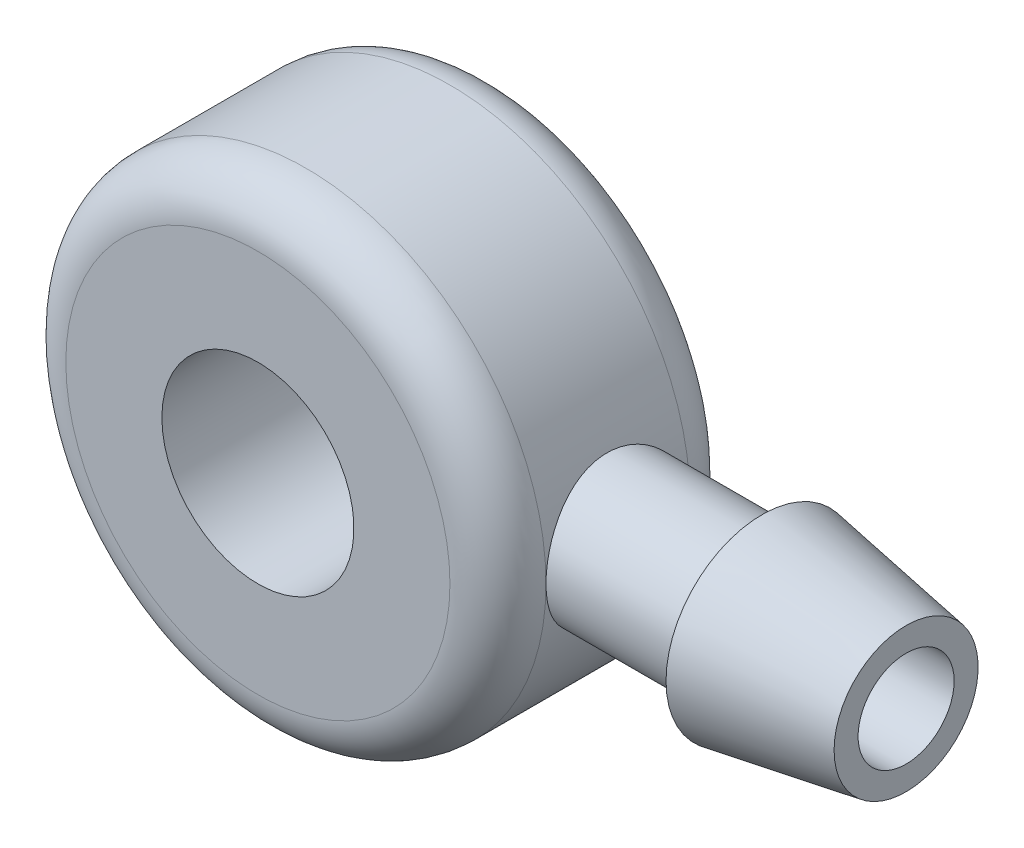
ISO-10303-21;
HEADER;
FILE_DESCRIPTION(('STEP AP214'),'2;1');
FILE_NAME('part.step','',(''),(''),'','','');
FILE_SCHEMA(('AUTOMOTIVE_DESIGN { 1 0 10303 214 1 1 1 1 }'));
ENDSEC;
DATA;
#1=APPLICATION_CONTEXT('core data for automotive mechanical design processes');
#2=APPLICATION_PROTOCOL_DEFINITION('international standard','automotive_design',2000,#1);
#3=PRODUCT_CONTEXT('',#1,'mechanical');
#4=PRODUCT('Part','Part','',(#3));
#5=PRODUCT_RELATED_PRODUCT_CATEGORY('part','',(#4));
#6=PRODUCT_DEFINITION_FORMATION('','',#4);
#7=PRODUCT_DEFINITION_CONTEXT('part definition',#1,'design');
#8=PRODUCT_DEFINITION('design','',#6,#7);
#9=PRODUCT_DEFINITION_SHAPE('','',#8);
#10=(LENGTH_UNIT() NAMED_UNIT(*) SI_UNIT(.MILLI.,.METRE.));
#11=(NAMED_UNIT(*) PLANE_ANGLE_UNIT() SI_UNIT($,.RADIAN.));
#12=(NAMED_UNIT(*) SI_UNIT($,.STERADIAN.) SOLID_ANGLE_UNIT());
#13=UNCERTAINTY_MEASURE_WITH_UNIT(LENGTH_MEASURE(1.E-05),#10,'distance_accuracy_value','');
#14=(GEOMETRIC_REPRESENTATION_CONTEXT(3) GLOBAL_UNCERTAINTY_ASSIGNED_CONTEXT((#13)) GLOBAL_UNIT_ASSIGNED_CONTEXT((#10,
#11,#12)) REPRESENTATION_CONTEXT('',''));
#15=CARTESIAN_POINT('',(0.,0.,0.));
#16=DIRECTION('',(0.,0.,1.));
#17=DIRECTION('',(1.,0.,0.));
#18=AXIS2_PLACEMENT_3D('',#15,#16,#17);
#19=CARTESIAN_POINT('',(0.,0.,5.));
#20=DIRECTION('',(0.,0.,-0.999999999999998));
#21=DIRECTION('',(-0.999999999999999,0.,0.));
#22=AXIS2_PLACEMENT_3D('',#19,#20,#21);
#23=CYLINDRICAL_SURFACE('',#22,5.);
#24=CARTESIAN_POINT('',(5.,0.,4.));
#25=CARTESIAN_POINT('',(4.99999929250549,-0.0822886127532972,3.99999900251511));
#26=CARTESIAN_POINT('',(4.99794915693951,-0.164587318351523,3.99320613637603));
#27=CARTESIAN_POINT('',(4.98997105593694,-0.326788125304873,3.9662786457779));
#28=CARTESIAN_POINT('',(4.98404193389702,-0.406689504411414,3.94614004197665));
#29=CARTESIAN_POINT('',(4.96895552501846,-0.561732707754519,3.89325398308974));
#30=CARTESIAN_POINT('',(4.95980300250428,-0.636881364395363,3.86052513038107));
#31=CARTESIAN_POINT('',(4.93922109237643,-0.780624181053123,3.78346390694417));
#32=CARTESIAN_POINT('',(4.92779140192067,-0.849217467469665,3.73912999260458));
#33=CARTESIAN_POINT('',(4.90350737192777,-0.979871797183748,3.63877599252733));
#34=CARTESIAN_POINT('',(4.89062383657039,-1.04171807124435,3.58248337411409));
#35=CARTESIAN_POINT('',(4.8650583421044,-1.15524920923323,3.46039077008982));
#36=CARTESIAN_POINT('',(4.85237641724493,-1.20693236327439,3.39458918787504));
#37=CARTESIAN_POINT('',(4.82834113993764,-1.29980037723706,3.25352924696239));
#38=CARTESIAN_POINT('',(4.81702406663872,-1.34072309022213,3.17809153900926));
#39=CARTESIAN_POINT('',(4.79743620394033,-1.40921394774761,3.0210107457697));
#40=CARTESIAN_POINT('',(4.78916468313312,-1.43678529919973,2.93936915607202));
#41=CARTESIAN_POINT('',(4.77690870838434,-1.47701633682651,2.77460973386954));
#42=CARTESIAN_POINT('',(4.77281069324533,-1.49007196234677,2.69159725613605));
#43=CARTESIAN_POINT('',(4.76902789749767,-1.50213730614672,2.52446684378323));
#44=CARTESIAN_POINT('',(4.76934204760572,-1.50115042761078,2.44034918194091));
#45=CARTESIAN_POINT('',(4.77424744067778,-1.48546977199812,2.27661609139152));
#46=CARTESIAN_POINT('',(4.7786838859914,-1.47127205262685,2.19694774963776));
#47=CARTESIAN_POINT('',(4.79108356228624,-1.43037420427056,2.04118021372654));
#48=CARTESIAN_POINT('',(4.79904714132352,-1.40367284141641,1.96508137262567));
#49=CARTESIAN_POINT('',(4.81772733074974,-1.33816026653681,1.81739965033926));
#50=CARTESIAN_POINT('',(4.82848016115953,-1.29918816934642,1.74589291604474));
#51=CARTESIAN_POINT('',(4.85150987000064,-1.21035222588683,1.6102679779898));
#52=CARTESIAN_POINT('',(4.8637871174699,-1.16048574002588,1.54615157058622));
#53=CARTESIAN_POINT('',(4.88911011297936,-1.04881290765546,1.42431380923798));
#54=CARTESIAN_POINT('',(4.90216654310498,-0.986594907466974,1.36697133597033));
#55=CARTESIAN_POINT('',(4.92712244063259,-0.853263259313969,1.26344601593575));
#56=CARTESIAN_POINT('',(4.9390218351841,-0.782149051860888,1.21726387158558));
#57=CARTESIAN_POINT('',(4.9604316006947,-0.6323550383428,1.13714007753527));
#58=CARTESIAN_POINT('',(4.96992543668314,-0.553627749747945,1.10328248375014));
#59=CARTESIAN_POINT('',(4.98533521832222,-0.391245415603507,1.04940040990036));
#60=CARTESIAN_POINT('',(4.99125216187,-0.307591751589565,1.0293720714675));
#61=CARTESIAN_POINT('',(4.99868364643539,-0.140952242668315,1.0043478221006));
#62=CARTESIAN_POINT('',(5.00034850417791,-0.0580500976011743,0.998838414198388));
#63=CARTESIAN_POINT('',(4.99952923241759,0.107499605823388,1.00156915571208));
#64=CARTESIAN_POINT('',(4.99704565677755,0.190147196690782,1.00980746965144));
#65=CARTESIAN_POINT('',(4.98830696987162,0.350903605309694,1.03938461111149));
#66=CARTESIAN_POINT('',(4.98213829799416,0.429072772614167,1.06042338758087));
#67=CARTESIAN_POINT('',(4.96674347841534,0.58075463895452,1.1146432327782));
#68=CARTESIAN_POINT('',(4.95751696321086,0.654266777025581,1.14782576103786));
#69=CARTESIAN_POINT('',(4.93669654351325,0.796437189461047,1.22625316548113));
#70=CARTESIAN_POINT('',(4.92505280829674,0.864943826199663,1.27175934094796));
#71=CARTESIAN_POINT('',(4.9007346876432,0.993523307980136,1.37322475405281));
#72=CARTESIAN_POINT('',(4.88806004431087,1.05359403235592,1.42918661188768));
#73=CARTESIAN_POINT('',(4.86253171869145,1.16585744551026,1.55238730836935));
#74=CARTESIAN_POINT('',(4.8496882503327,1.21768481231503,1.61996187577173));
#75=CARTESIAN_POINT('',(4.82576515238462,1.30928995072154,1.76312793901352));
#76=CARTESIAN_POINT('',(4.81468547654652,1.34906803829472,1.83871922455821));
#77=CARTESIAN_POINT('',(4.79567189615057,1.41517347127169,1.99553249125469));
#78=CARTESIAN_POINT('',(4.78772337843828,1.4415634693705,2.07672618653659));
#79=CARTESIAN_POINT('',(4.77591594362795,1.48021730815114,2.24268796893148));
#80=CARTESIAN_POINT('',(4.77205562508301,1.49248598978779,2.32745482078767));
#81=CARTESIAN_POINT('',(4.76899972496087,1.50221984485059,2.49436151837623));
#82=CARTESIAN_POINT('',(4.76961647442754,1.5002805530849,2.57646365101759));
#83=CARTESIAN_POINT('',(4.77499401288296,1.48307505444813,2.7391141033728));
#84=CARTESIAN_POINT('',(4.77975463592555,1.46780938124716,2.81966248517635));
#85=CARTESIAN_POINT('',(4.79275763670389,1.42476888804136,2.97594539914285));
#86=CARTESIAN_POINT('',(4.80095604545965,1.39715175507068,3.0517272873617));
#87=CARTESIAN_POINT('',(4.81990278909137,1.33031507121129,3.19764243881773));
#88=CARTESIAN_POINT('',(4.83065161194315,1.29109329962877,3.26777461764076));
#89=CARTESIAN_POINT('',(4.85397676425836,1.20048763805073,3.40316311652711));
#90=CARTESIAN_POINT('',(4.86660540163799,1.14871276092994,3.46814876126041));
#91=CARTESIAN_POINT('',(4.89201320450026,1.03517434629782,3.58870249830786));
#92=CARTESIAN_POINT('',(4.90479240823905,0.973408217134498,3.64426813946776));
#93=CARTESIAN_POINT('',(4.92950936570649,0.839465762183246,3.74602341229503));
#94=CARTESIAN_POINT('',(4.94141159765674,0.767037885790605,3.79189144685549));
#95=CARTESIAN_POINT('',(4.96260680455814,0.615141373983528,3.87073516990402));
#96=CARTESIAN_POINT('',(4.97190099931068,0.535676052998955,3.90371688827451));
#97=CARTESIAN_POINT('',(4.98602174969302,0.380757712655283,3.95289527565275));
#98=CARTESIAN_POINT('',(4.99122027381068,0.305786961954235,3.97051167288325));
#99=CARTESIAN_POINT('',(4.99820944494493,0.15388019523078,3.99406352524158));
#100=CARTESIAN_POINT('',(5.00000066154741,0.0769445098581394,4.00000093270482));
#101=CARTESIAN_POINT('',(5.,0.,4.));
#102=B_SPLINE_CURVE_WITH_KNOTS('',3,(#24,#25,#26,#27,#28,#29,#30,#31,#32,#33,#34,#35,#36,#37,
#38,#39,#40,#41,#42,#43,#44,#45,#46,#47,#48,#49,#50,#51,#52,#53,#54,#55,#56,#57,#58,#59,#60,#61,
#62,#63,#64,#65,#66,#67,#68,#69,#70,#71,#72,#73,#74,#75,#76,#77,#78,#79,#80,#81,#82,#83,#84,#85,
#86,#87,#88,#89,#90,#91,#92,#93,#94,#95,#96,#97,#98,#99,#100,#101),.UNSPECIFIED.,.T.,.F.,(4,2,2,
2,2,2,2,2,2,2,2,2,2,2,2,2,2,2,2,2,2,2,2,2,2,2,2,2,2,2,2,2,2,2,2,2,2,2,4),(0.,0.246583203612604,
0.493239964845984,0.739533676300867,0.985860164412703,1.23855602948192,1.49129437288633,
1.74971481004109,2.00807314543224,2.25919689356599,2.51025978319089,2.75226016697676,
2.99428443658002,3.2396242644712,3.48502360158555,3.74067104048166,3.99633456531071,
4.2537104688169,4.5110145352881,4.75908809438546,5.00712853550326,5.24956746682327,
5.49203554593728,5.74011305702907,5.98825282000189,6.24540400322818,6.5025484425268,
6.75847814951251,7.01432009460283,7.25950155466943,7.504673196616,7.74680040402721,
7.98897397553107,8.2399692567993,8.49102974897502,8.7494299615667,9.00770911595235,
9.23831691930459,9.46888616948874),.UNSPECIFIED.);
#103=CARTESIAN_POINT('',(5.,0.,4.));
#104=VERTEX_POINT('',#103);
#105=CARTESIAN_POINT('',(5.,0.,0.999999999999997));
#106=VERTEX_POINT('',#105);
#107=EDGE_CURVE('E74',#104,#106,#102,.T.);
#108=ORIENTED_EDGE('',*,*,#107,.F.);
#109=CARTESIAN_POINT('',(0.,0.,4.00000000000001));
#110=DIRECTION('',(0.,0.,0.999999999999998));
#111=DIRECTION('',(0.999999999999999,0.,0.));
#112=AXIS2_PLACEMENT_3D('',#109,#110,#111);
#113=CIRCLE('',#112,5.);
#114=EDGE_CURVE('E52',#104,#104,#113,.F.);
#115=ORIENTED_EDGE('',*,*,#114,.T.);
#116=EDGE_CURVE('E49',#106,#104,#102,.T.);
#117=ORIENTED_EDGE('',*,*,#116,.F.);
#118=CARTESIAN_POINT('',(0.,0.,0.999999999999997));
#119=DIRECTION('',(0.,0.,0.999999999999998));
#120=DIRECTION('',(0.999999999999999,0.,0.));
#121=AXIS2_PLACEMENT_3D('',#118,#119,#120);
#122=CIRCLE('',#121,5.);
#123=EDGE_CURVE('E55',#106,#106,#122,.T.);
#124=ORIENTED_EDGE('',*,*,#123,.T.);
#125=EDGE_LOOP('',(#108,#115,#117,#124));
#126=FACE_BOUND('',#125,.T.);
#127=ADVANCED_FACE('F34',(#126),#23,.T.);
#128=CARTESIAN_POINT('',(0.,0.,5.));
#129=DIRECTION('',(0.,0.,0.999999999999998));
#130=DIRECTION('',(0.999999999999999,0.,0.));
#131=AXIS2_PLACEMENT_3D('',#128,#129,#130);
#132=PLANE('',#131);
#133=CARTESIAN_POINT('',(0.,0.,5.));
#134=DIRECTION('',(0.,0.,-0.999999999999998));
#135=DIRECTION('',(-0.999999999999999,0.,0.));
#136=AXIS2_PLACEMENT_3D('',#133,#134,#135);
#137=CIRCLE('',#136,2.);
#138=CARTESIAN_POINT('',(-2.,0.,5.));
#139=VERTEX_POINT('',#138);
#140=EDGE_CURVE('E56',#139,#139,#137,.T.);
#141=ORIENTED_EDGE('',*,*,#140,.T.);
#142=EDGE_LOOP('',(#141));
#143=FACE_BOUND('',#142,.T.);
#144=CARTESIAN_POINT('',(0.,0.,5.));
#145=DIRECTION('',(0.,0.,0.999999999999998));
#146=DIRECTION('',(0.999999999999999,0.,0.));
#147=AXIS2_PLACEMENT_3D('',#144,#145,#146);
#148=CIRCLE('',#147,4.);
#149=CARTESIAN_POINT('',(4.,0.,5.));
#150=VERTEX_POINT('',#149);
#151=EDGE_CURVE('E11',#150,#150,#148,.T.);
#152=ORIENTED_EDGE('',*,*,#151,.T.);
#153=EDGE_LOOP('',(#152));
#154=FACE_BOUND('',#153,.T.);
#155=ADVANCED_FACE('F100',(#143,#154),#132,.T.);
#156=CARTESIAN_POINT('',(0.,0.,0.));
#157=DIRECTION('',(0.,0.,0.999999999999998));
#158=DIRECTION('',(0.999999999999999,0.,0.));
#159=AXIS2_PLACEMENT_3D('',#156,#157,#158);
#160=PLANE('',#159);
#161=CARTESIAN_POINT('',(0.,0.,0.));
#162=DIRECTION('',(0.,0.,-0.999999999999998));
#163=DIRECTION('',(-0.999999999999999,0.,0.));
#164=AXIS2_PLACEMENT_3D('',#161,#162,#163);
#165=CIRCLE('',#164,2.);
#166=CARTESIAN_POINT('',(-2.,0.,0.));
#167=VERTEX_POINT('',#166);
#168=EDGE_CURVE('E60',#167,#167,#165,.T.);
#169=ORIENTED_EDGE('',*,*,#168,.F.);
#170=EDGE_LOOP('',(#169));
#171=FACE_BOUND('',#170,.T.);
#172=CARTESIAN_POINT('',(0.,0.,0.));
#173=DIRECTION('',(0.,0.,0.999999999999998));
#174=DIRECTION('',(0.999999999999999,0.,0.));
#175=AXIS2_PLACEMENT_3D('',#172,#173,#174);
#176=CIRCLE('',#175,4.);
#177=CARTESIAN_POINT('',(4.,0.,0.));
#178=VERTEX_POINT('',#177);
#179=EDGE_CURVE('E42',#178,#178,#176,.F.);
#180=ORIENTED_EDGE('',*,*,#179,.T.);
#181=EDGE_LOOP('',(#180));
#182=FACE_BOUND('',#181,.T.);
#183=ADVANCED_FACE('F66',(#171,#182),#160,.F.);
#184=CARTESIAN_POINT('',(0.,0.,0.999999999999997));
#185=DIRECTION('',(0.,0.,0.999999999999998));
#186=DIRECTION('',(0.999999999999999,0.,0.));
#187=AXIS2_PLACEMENT_3D('',#184,#185,#186);
#188=TOROIDAL_SURFACE('',#187,4.,1.);
#189=ORIENTED_EDGE('',*,*,#179,.F.);
#190=EDGE_LOOP('',(#189));
#191=FACE_BOUND('',#190,.T.);
#192=ORIENTED_EDGE('',*,*,#123,.F.);
#193=EDGE_LOOP('',(#192));
#194=FACE_BOUND('',#193,.T.);
#195=ADVANCED_FACE('F68',(#191,#194),#188,.T.);
#196=CARTESIAN_POINT('',(0.,0.,4.00000000000001));
#197=DIRECTION('',(0.,0.,0.999999999999998));
#198=DIRECTION('',(0.999999999999999,0.,0.));
#199=AXIS2_PLACEMENT_3D('',#196,#197,#198);
#200=TOROIDAL_SURFACE('',#199,4.,1.);
#201=ORIENTED_EDGE('',*,*,#114,.F.);
#202=EDGE_LOOP('',(#201));
#203=FACE_BOUND('',#202,.T.);
#204=ORIENTED_EDGE('',*,*,#151,.F.);
#205=EDGE_LOOP('',(#204));
#206=FACE_BOUND('',#205,.T.);
#207=ADVANCED_FACE('F36',(#203,#206),#200,.T.);
#208=CARTESIAN_POINT('',(0.,0.,5.));
#209=DIRECTION('',(0.,0.,-0.999999999999998));
#210=DIRECTION('',(-0.999999999999999,0.,0.));
#211=AXIS2_PLACEMENT_3D('',#208,#209,#210);
#212=CYLINDRICAL_SURFACE('',#211,2.);
#213=CARTESIAN_POINT('',(2.,0.,1.5));
#214=CARTESIAN_POINT('',(1.99999713404151,0.0525719629529868,1.5000033023195));
#215=CARTESIAN_POINT('',(1.99790491019518,0.105206599698033,1.50417007312167));
#216=CARTESIAN_POINT('',(1.98974156037396,0.208920235268427,1.52065288034092));
#217=CARTESIAN_POINT('',(1.98366287828983,0.259996086713506,1.53298439299765));
#218=CARTESIAN_POINT('',(1.96816279403311,0.358933544880577,1.56519380861679));
#219=CARTESIAN_POINT('',(1.9587543917752,0.406806802939181,1.58504238424801));
#220=CARTESIAN_POINT('',(1.93745776515779,0.498472616806566,1.63157062136494));
#221=CARTESIAN_POINT('',(1.92556973633531,0.542265493990052,1.65824974424885));
#222=CARTESIAN_POINT('',(1.89956258258058,0.627507817761921,1.7195172494853));
#223=CARTESIAN_POINT('',(1.88535199127536,0.668655211122112,1.75448647923964));
#224=CARTESIAN_POINT('',(1.85659970246744,0.744779444866977,1.83052147924703));
#225=CARTESIAN_POINT('',(1.84205776209035,0.779751583106768,1.87159185177244));
#226=CARTESIAN_POINT('',(1.81298951197347,0.84525200045028,1.96248334952338));
#227=CARTESIAN_POINT('',(1.79855186970132,0.875225335551637,2.01273609834591));
#228=CARTESIAN_POINT('',(1.77285978772321,0.926168226890691,2.11836733598621));
#229=CARTESIAN_POINT('',(1.7616030760699,0.947144214966327,2.17374212872274));
#230=CARTESIAN_POINT('',(1.74457867037809,0.978132442188584,2.28466510542192));
#231=CARTESIAN_POINT('',(1.73852271583714,0.98872585708044,2.34000445206739));
#232=CARTESIAN_POINT('',(1.73181889948528,1.00042699330885,2.45197883777948));
#233=CARTESIAN_POINT('',(1.73116569343288,1.00154408837307,2.50861254087116));
#234=CARTESIAN_POINT('',(1.73510930257248,0.994687287172294,2.61428602431537));
#235=CARTESIAN_POINT('',(1.73908763662014,0.987784559536822,2.66342403122305));
#236=CARTESIAN_POINT('',(1.75076228733851,0.966939849056932,2.75972190937304));
#237=CARTESIAN_POINT('',(1.75845978831777,0.95299562389765,2.80688114530532));
#238=CARTESIAN_POINT('',(1.77687476412742,0.918209780386002,2.89922913256566));
#239=CARTESIAN_POINT('',(1.78765840663999,0.897215067115995,2.94434639878579));
#240=CARTESIAN_POINT('',(1.81103404281404,0.849041687668003,3.03063429259001));
#241=CARTESIAN_POINT('',(1.8236268478019,0.821860243812466,3.07180313560009));
#242=CARTESIAN_POINT('',(1.85113157903285,0.758066054912783,3.15452125274323));
#243=CARTESIAN_POINT('',(1.86613510236744,0.720694458369273,3.19545687357616));
#244=CARTESIAN_POINT('',(1.8954762330041,0.639555578741371,3.27073541859091));
#245=CARTESIAN_POINT('',(1.90981351958809,0.595785256574292,3.30507519203388));
#246=CARTESIAN_POINT('',(1.93701987282972,0.500516505831853,3.36768566102972));
#247=CARTESIAN_POINT('',(1.9497898416201,0.448753591599403,3.39560047244574));
#248=CARTESIAN_POINT('',(1.9715788112124,0.340466215488785,3.44209702904301));
#249=CARTESIAN_POINT('',(1.98060078943552,0.283945576265268,3.46068618501517));
#250=CARTESIAN_POINT('',(1.99324333741437,0.172766491660697,3.48647540371668));
#251=CARTESIAN_POINT('',(1.99724938301312,0.11834153054832,3.49449123574678));
#252=CARTESIAN_POINT('',(2.00073013459102,0.00877959994935154,3.50146473113449));
#253=CARTESIAN_POINT('',(2.00020698721312,-0.046357019869901,3.50042668563948));
#254=CARTESIAN_POINT('',(1.99491192253441,-0.151232971985993,3.48979331158124));
#255=CARTESIAN_POINT('',(1.99047245688189,-0.201059408049955,3.48086746726997));
#256=CARTESIAN_POINT('',(1.97822171314819,-0.298406892301922,3.45576192810491));
#257=CARTESIAN_POINT('',(1.97041006334333,-0.345927685691004,3.43958143354664));
#258=CARTESIAN_POINT('',(1.9518425141367,-0.438888608449672,3.40000153356682));
#259=CARTESIAN_POINT('',(1.94100881769939,-0.484230397006158,3.37640894988319));
#260=CARTESIAN_POINT('',(1.91743974317109,-0.570461361698922,3.32289246435396));
#261=CARTESIAN_POINT('',(1.90470355565786,-0.611348629775283,3.29296586540656));
#262=CARTESIAN_POINT('',(1.87708221337465,-0.69176768929065,3.22423957466713));
#263=CARTESIAN_POINT('',(1.8621088484844,-0.730772077824632,3.18485713154644));
#264=CARTESIAN_POINT('',(1.83262391603875,-0.801856321113236,3.1000748487307));
#265=CARTESIAN_POINT('',(1.81811267381531,-0.833931385690845,3.05467088118363));
#266=CARTESIAN_POINT('',(1.79051192226074,-0.891707914497702,2.95635634579969));
#267=CARTESIAN_POINT('',(1.77752529663474,-0.917025495878637,2.9031887337914));
#268=CARTESIAN_POINT('',(1.75574072368123,-0.958082826013802,2.79248993230748));
#269=CARTESIAN_POINT('',(1.74693738240614,-0.973834915887577,2.73496447349881));
#270=CARTESIAN_POINT('',(1.73561501008664,-0.993861687449686,2.62308977713855));
#271=CARTESIAN_POINT('',(1.7325738346049,-0.999092996400867,2.56896574657096));
#272=CARTESIAN_POINT('',(1.73165354646175,-1.00068915438079,2.46055293282927));
#273=CARTESIAN_POINT('',(1.73377219627552,-0.997057846624398,2.40626423126056));
#274=CARTESIAN_POINT('',(1.74237862050025,-0.981926125592264,2.30451649846798));
#275=CARTESIAN_POINT('',(1.74843094482395,-0.971208314342802,2.2568995298556));
#276=CARTESIAN_POINT('',(1.76371016187915,-0.943175358224646,2.1641918805753));
#277=CARTESIAN_POINT('',(1.77293807569669,-0.925858091159808,2.11910201790803));
#278=CARTESIAN_POINT('',(1.7942853036452,-0.883815745300679,2.02937514901339));
#279=CARTESIAN_POINT('',(1.80655722396186,-0.858671137816454,1.9849720981703));
#280=CARTESIAN_POINT('',(1.83235331634594,-0.802150971636637,1.90072546381941));
#281=CARTESIAN_POINT('',(1.8458781379453,-0.770772171238659,1.86088426948151));
#282=CARTESIAN_POINT('',(1.87462323159321,-0.698203326664648,1.78185801764238));
#283=CARTESIAN_POINT('',(1.8898498331147,-0.656284423010166,1.74334089763807));
#284=CARTESIAN_POINT('',(1.91877752255085,-0.566154806220271,1.67373701657636));
#285=CARTESIAN_POINT('',(1.9324777860804,-0.517940723256784,1.64265426057371));
#286=CARTESIAN_POINT('',(1.95698009585104,-0.415931596819951,1.5887636372378));
#287=CARTESIAN_POINT('',(1.96776096562909,-0.362099503934615,1.56601583058857));
#288=CARTESIAN_POINT('',(1.98501341363465,-0.250742101294191,1.53019183208105));
#289=CARTESIAN_POINT('',(1.99149723372933,-0.193227799623167,1.51708815317042));
#290=CARTESIAN_POINT('',(1.99695461909663,-0.112601946483385,1.50610258892415));
#291=CARTESIAN_POINT('',(1.99809365339201,-0.0901618794394996,1.50381735913638));
#292=CARTESIAN_POINT('',(1.99961696977865,-0.0451517318071581,1.50076533448319));
#293=CARTESIAN_POINT('',(2.00000123103763,-0.0225816476473817,1.4999985815288));
#294=CARTESIAN_POINT('',(2.,0.,1.5));
#295=B_SPLINE_CURVE_WITH_KNOTS('',3,(#213,#214,#215,#216,#217,#218,#219,#220,#221,#222,#223,
#224,#225,#226,#227,#228,#229,#230,#231,#232,#233,#234,#235,#236,#237,#238,#239,#240,#241,#242,
#243,#244,#245,#246,#247,#248,#249,#250,#251,#252,#253,#254,#255,#256,#257,#258,#259,#260,#261,
#262,#263,#264,#265,#266,#267,#268,#269,#270,#271,#272,#273,#274,#275,#276,#277,#278,#279,#280,
#281,#282,#283,#284,#285,#286,#287,#288,#289,#290,#291,#292,#293,#294),.UNSPECIFIED.,.T.,.F.,(4,
2,2,2,2,2,2,2,2,2,2,2,2,2,2,2,2,2,2,2,2,2,2,2,2,2,2,2,2,2,2,2,2,2,2,2,2,2,2,2,4),(0.,
0.157624257420294,0.315548149709201,0.4728621554923,0.630163760581567,0.796981758718089,
0.963926237654036,1.14381726430752,1.3235794789828,1.49258012140229,1.66141357329021,
1.81005712409321,1.95874803925679,2.11090240168487,2.26312521260221,2.43464941333879,
2.60625534598688,2.78583022214442,2.96526216912281,3.12983290471346,3.29432564511476,
3.44606906506122,3.59782921630933,3.75392856027899,3.91009450748339,4.08159610644418,
4.25321588615431,4.43314682159674,4.61284511940779,4.77529307498374,4.93767059860006,
5.08457930244183,5.23153528783677,5.38836456775615,5.54527561138961,5.721252427525,
5.89732383376573,6.07464013662926,6.25144908624931,6.31915280137698,6.38685838514848),.UNSPECIFIED.);
#296=CARTESIAN_POINT('',(2.,0.,1.5));
#297=VERTEX_POINT('',#296);
#298=EDGE_CURVE('E102',#297,#297,#295,.T.);
#299=ORIENTED_EDGE('',*,*,#298,.T.);
#300=EDGE_LOOP('',(#299));
#301=FACE_BOUND('',#300,.T.);
#302=ORIENTED_EDGE('',*,*,#140,.F.);
#303=EDGE_LOOP('',(#302));
#304=FACE_BOUND('',#303,.T.);
#305=ORIENTED_EDGE('',*,*,#168,.T.);
#306=EDGE_LOOP('',(#305));
#307=FACE_BOUND('',#306,.T.);
#308=ADVANCED_FACE('F93',(#301,#304,#307),#212,.F.);
#309=CARTESIAN_POINT('',(5.,0.,2.5));
#310=DIRECTION('',(-0.999999999999999,0.,0.));
#311=DIRECTION('',(0.,0.,0.999999999999998));
#312=AXIS2_PLACEMENT_3D('',#309,#310,#311);
#313=CYLINDRICAL_SURFACE('',#312,1.5);
#314=CARTESIAN_POINT('',(7.99999999999999,0.,2.49999999999999));
#315=DIRECTION('',(-0.999999999999999,0.,0.));
#316=DIRECTION('',(0.,0.,0.999999999999998));
#317=AXIS2_PLACEMENT_3D('',#314,#315,#316);
#318=CIRCLE('',#317,1.5);
#319=CARTESIAN_POINT('',(7.99999999999999,0.,3.99999999999999));
#320=VERTEX_POINT('',#319);
#321=EDGE_CURVE('E78',#320,#320,#318,.T.);
#322=ORIENTED_EDGE('',*,*,#321,.T.);
#323=EDGE_LOOP('',(#322));
#324=FACE_BOUND('',#323,.T.);
#325=ORIENTED_EDGE('',*,*,#116,.T.);
#326=ORIENTED_EDGE('',*,*,#107,.T.);
#327=EDGE_LOOP('',(#325,#326));
#328=FACE_BOUND('',#327,.T.);
#329=ADVANCED_FACE('F75',(#324,#328),#313,.T.);
#330=CARTESIAN_POINT('',(8.00000000000001,0.,1.));
#331=DIRECTION('',(0.999999999999999,0.,0.));
#332=DIRECTION('',(0.,0.,-0.999999999999998));
#333=AXIS2_PLACEMENT_3D('',#330,#331,#332);
#334=PLANE('',#333);
#335=ORIENTED_EDGE('',*,*,#321,.F.);
#336=EDGE_LOOP('',(#335));
#337=FACE_BOUND('',#336,.T.);
#338=CARTESIAN_POINT('',(7.99999999999999,0.,2.49999999999999));
#339=DIRECTION('',(-0.999999999999999,0.,0.));
#340=DIRECTION('',(0.,0.,0.999999999999998));
#341=AXIS2_PLACEMENT_3D('',#338,#339,#340);
#342=CIRCLE('',#341,2.);
#343=CARTESIAN_POINT('',(7.99999999999999,0.,4.49999999999999));
#344=VERTEX_POINT('',#343);
#345=EDGE_CURVE('E206',#344,#344,#342,.T.);
#346=ORIENTED_EDGE('',*,*,#345,.T.);
#347=EDGE_LOOP('',(#346));
#348=FACE_BOUND('',#347,.T.);
#349=ADVANCED_FACE('F92',(#337,#348),#334,.F.);
#350=CARTESIAN_POINT('',(11.,0.,2.5));
#351=DIRECTION('',(-0.999999999999999,0.,0.));
#352=DIRECTION('',(0.,0.,0.999999999999998));
#353=AXIS2_PLACEMENT_3D('',#350,#351,#352);
#354=CONICAL_SURFACE('',#353,1.5,0.165148677414627);
#355=CARTESIAN_POINT('',(11.,0.,2.5));
#356=DIRECTION('',(-0.999999999999999,0.,0.));
#357=DIRECTION('',(0.,0.,0.999999999999998));
#358=AXIS2_PLACEMENT_3D('',#355,#356,#357);
#359=CIRCLE('',#358,1.5);
#360=CARTESIAN_POINT('',(11.,0.,4.));
#361=VERTEX_POINT('',#360);
#362=EDGE_CURVE('E110',#361,#361,#359,.T.);
#363=CARTESIAN_POINT('',(7.99999999999999,0.,4.49999999999999));
#364=CARTESIAN_POINT('',(8.03124999999999,0.,4.49479166666666));
#365=CARTESIAN_POINT('',(8.06249999999999,0.,4.48958333333333));
#366=CARTESIAN_POINT('',(8.12499999999999,0.,4.47916666666666));
#367=CARTESIAN_POINT('',(8.15624999999999,0.,4.47395833333333));
#368=CARTESIAN_POINT('',(8.21874999999999,0.,4.46354166666666));
#369=CARTESIAN_POINT('',(8.24999999999999,0.,4.45833333333333));
#370=CARTESIAN_POINT('',(8.31249999999999,0.,4.44791666666666));
#371=CARTESIAN_POINT('',(8.34374999999999,0.,4.44270833333333));
#372=CARTESIAN_POINT('',(8.40624999999999,0.,4.43229166666666));
#373=CARTESIAN_POINT('',(8.43749999999999,0.,4.42708333333333));
#374=CARTESIAN_POINT('',(8.49999999999999,0.,4.41666666666666));
#375=CARTESIAN_POINT('',(8.53124999999999,0.,4.41145833333333));
#376=CARTESIAN_POINT('',(8.59374999999999,0.,4.40104166666666));
#377=CARTESIAN_POINT('',(8.62499999999999,0.,4.39583333333333));
#378=CARTESIAN_POINT('',(8.68749999999999,0.,4.38541666666666));
#379=CARTESIAN_POINT('',(8.71874999999999,0.,4.38020833333333));
#380=CARTESIAN_POINT('',(8.78124999999999,0.,4.36979166666666));
#381=CARTESIAN_POINT('',(8.81249999999999,0.,4.36458333333333));
#382=CARTESIAN_POINT('',(8.87499999999999,0.,4.35416666666666));
#383=CARTESIAN_POINT('',(8.90624999999999,0.,4.34895833333333));
#384=CARTESIAN_POINT('',(8.96874999999999,0.,4.33854166666666));
#385=CARTESIAN_POINT('',(8.99999999999999,0.,4.33333333333333));
#386=CARTESIAN_POINT('',(9.06249999999999,0.,4.32291666666666));
#387=CARTESIAN_POINT('',(9.09374999999999,0.,4.31770833333333));
#388=CARTESIAN_POINT('',(9.15624999999999,0.,4.30729166666666));
#389=CARTESIAN_POINT('',(9.18749999999999,0.,4.30208333333333));
#390=CARTESIAN_POINT('',(9.24999999999999,0.,4.29166666666666));
#391=CARTESIAN_POINT('',(9.28124999999999,0.,4.28645833333333));
#392=CARTESIAN_POINT('',(9.34374999999999,0.,4.27604166666666));
#393=CARTESIAN_POINT('',(9.37499999999999,0.,4.27083333333333));
#394=CARTESIAN_POINT('',(9.43749999999999,0.,4.26041666666666));
#395=CARTESIAN_POINT('',(9.46874999999999,0.,4.25520833333333));
#396=CARTESIAN_POINT('',(9.53124999999999,0.,4.24479166666666));
#397=CARTESIAN_POINT('',(9.56249999999999,0.,4.23958333333333));
#398=CARTESIAN_POINT('',(9.62499999999999,0.,4.22916666666666));
#399=CARTESIAN_POINT('',(9.65624999999999,0.,4.22395833333333));
#400=CARTESIAN_POINT('',(9.71874999999999,0.,4.21354166666666));
#401=CARTESIAN_POINT('',(9.74999999999999,0.,4.20833333333333));
#402=CARTESIAN_POINT('',(9.81249999999999,0.,4.19791666666666));
#403=CARTESIAN_POINT('',(9.84374999999999,0.,4.19270833333333));
#404=CARTESIAN_POINT('',(9.90624999999999,0.,4.18229166666666));
#405=CARTESIAN_POINT('',(9.93749999999999,0.,4.17708333333333));
#406=CARTESIAN_POINT('',(9.99999999999999,0.,4.16666666666666));
#407=CARTESIAN_POINT('',(10.03125,0.,4.16145833333333));
#408=CARTESIAN_POINT('',(10.09375,0.,4.15104166666666));
#409=CARTESIAN_POINT('',(10.125,0.,4.14583333333333));
#410=CARTESIAN_POINT('',(10.1875,0.,4.13541666666666));
#411=CARTESIAN_POINT('',(10.21875,0.,4.13020833333333));
#412=CARTESIAN_POINT('',(10.28125,0.,4.11979166666666));
#413=CARTESIAN_POINT('',(10.3125,0.,4.11458333333333));
#414=CARTESIAN_POINT('',(10.375,0.,4.10416666666666));
#415=CARTESIAN_POINT('',(10.40625,0.,4.09895833333333));
#416=CARTESIAN_POINT('',(10.46875,0.,4.08854166666666));
#417=CARTESIAN_POINT('',(10.5,0.,4.08333333333333));
#418=CARTESIAN_POINT('',(10.5625,0.,4.07291666666666));
#419=CARTESIAN_POINT('',(10.59375,0.,4.06770833333333));
#420=CARTESIAN_POINT('',(10.65625,0.,4.05729166666666));
#421=CARTESIAN_POINT('',(10.6875,0.,4.05208333333333));
#422=CARTESIAN_POINT('',(10.75,0.,4.04166666666666));
#423=CARTESIAN_POINT('',(10.78125,0.,4.03645833333333));
#424=CARTESIAN_POINT('',(10.84375,0.,4.02604166666666));
#425=CARTESIAN_POINT('',(10.875,0.,4.02083333333333));
#426=CARTESIAN_POINT('',(10.9375,0.,4.01041666666666));
#427=CARTESIAN_POINT('',(10.96875,0.,4.00520833333333));
#428=CARTESIAN_POINT('',(11.,0.,4.));
#429=B_SPLINE_CURVE_WITH_KNOTS('',3,(#363,#364,#365,#366,#367,#368,#369,#370,#371,#372,#373,
#374,#375,#376,#377,#378,#379,#380,#381,#382,#383,#384,#385,#386,#387,#388,#389,#390,#391,#392,
#393,#394,#395,#396,#397,#398,#399,#400,#401,#402,#403,#404,#405,#406,#407,#408,#409,#410,#411,
#412,#413,#414,#415,#416,#417,#418,#419,#420,#421,#422,#423,#424,#425,#426,#427,#428),
.UNSPECIFIED.,.F.,.F.,(4,2,2,2,2,2,2,2,2,2,2,2,2,2,2,2,2,2,2,2,2,2,2,2,2,2,2,2,2,2,2,2,4),(0.,
0.0950431645359098,0.19008632907182,0.285129493607729,0.380172658143641,0.475215822679551,
0.570258987215459,0.665302151751368,0.76034531628728,0.85538848082319,0.9504316453591,
1.04547480989501,1.14051797443092,1.23556113896683,1.33060430350274,1.42564746803865,
1.52069063257456,1.61573379711047,1.71077696164638,1.80582012618229,1.9008632907182,
1.99590645525411,2.09094961979002,2.18599278432592,2.28103594886183,2.37607911339775,
2.47112227793366,2.56616544246956,2.66120860700547,2.75625177154138,2.85129493607729,
2.9463381006132,3.04138126514911),.UNSPECIFIED.);
#430=EDGE_CURVE('BSEAM119',#344,#361,#429,.T.);
#431=ORIENTED_EDGE('',*,*,#345,.F.);
#432=ORIENTED_EDGE('',*,*,#362,.T.);
#433=ORIENTED_EDGE('',*,*,#430,.T.);
#434=ORIENTED_EDGE('',*,*,#430,.F.);
#435=EDGE_LOOP('',(#431,#433,#432,#434));
#436=FACE_BOUND('',#435,.T.);
#437=ADVANCED_FACE('F119',(#436),#354,.T.);
#438=CARTESIAN_POINT('',(11.,0.,0.999999999999997));
#439=DIRECTION('',(-0.999999999999999,0.,0.));
#440=DIRECTION('',(0.,0.,0.999999999999998));
#441=AXIS2_PLACEMENT_3D('',#438,#439,#440);
#442=PLANE('',#441);
#443=CARTESIAN_POINT('',(11.,0.,2.5));
#444=DIRECTION('',(0.999999999999999,0.,0.));
#445=DIRECTION('',(0.,0.,-0.999999999999998));
#446=AXIS2_PLACEMENT_3D('',#443,#444,#445);
#447=CIRCLE('',#446,1.);
#448=CARTESIAN_POINT('',(11.,0.,1.5));
#449=VERTEX_POINT('',#448);
#450=EDGE_CURVE('E111',#449,#449,#447,.T.);
#451=ORIENTED_EDGE('',*,*,#450,.F.);
#452=EDGE_LOOP('',(#451));
#453=FACE_BOUND('',#452,.T.);
#454=ORIENTED_EDGE('',*,*,#362,.F.);
#455=EDGE_LOOP('',(#454));
#456=FACE_BOUND('',#455,.T.);
#457=ADVANCED_FACE('F116',(#453,#456),#442,.F.);
#458=CARTESIAN_POINT('',(1.,0.,2.5));
#459=DIRECTION('',(0.999999999999999,0.,0.));
#460=DIRECTION('',(0.,0.,-0.999999999999998));
#461=AXIS2_PLACEMENT_3D('',#458,#459,#460);
#462=CYLINDRICAL_SURFACE('',#461,1.);
#463=ORIENTED_EDGE('',*,*,#450,.T.);
#464=EDGE_LOOP('',(#463));
#465=FACE_BOUND('',#464,.T.);
#466=ORIENTED_EDGE('',*,*,#298,.F.);
#467=EDGE_LOOP('',(#466));
#468=FACE_BOUND('',#467,.T.);
#469=ADVANCED_FACE('F112',(#465,#468),#462,.F.);
#470=CLOSED_SHELL('',(#127,#155,#183,#195,#207,#308,#329,#349,#437,#457,#469));
#471=MANIFOLD_SOLID_BREP('B2',#470);
#472=ADVANCED_BREP_SHAPE_REPRESENTATION('',(#18,#471),#14);
#473=SHAPE_DEFINITION_REPRESENTATION(#9,#472);
ENDSEC;
END-ISO-10303-21;
